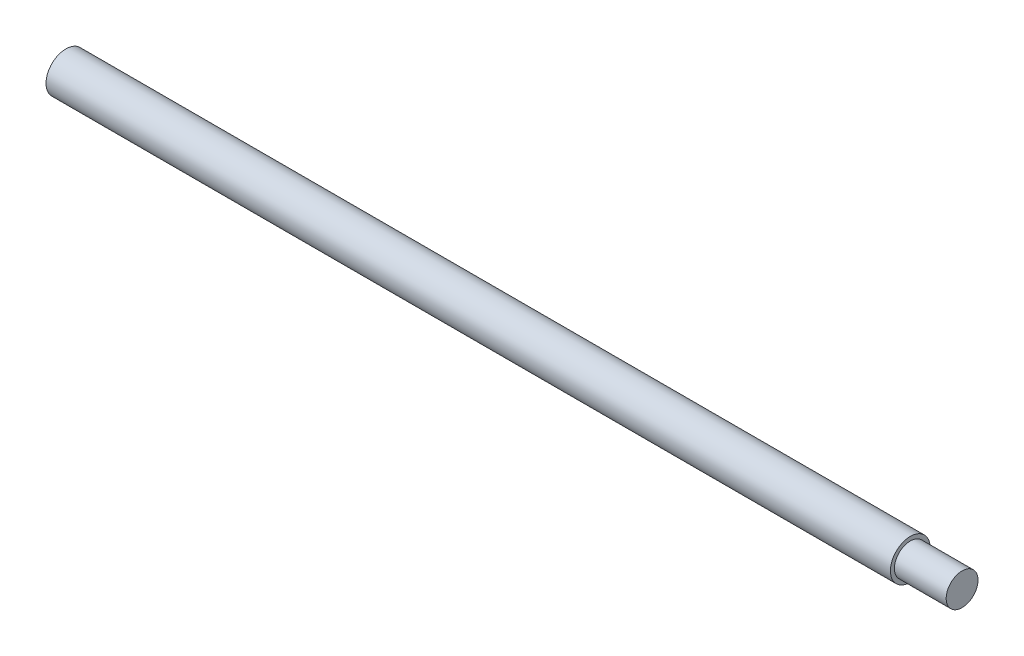
ISO-10303-21;
HEADER;
FILE_DESCRIPTION(('STEP AP214'),'2;1');
FILE_NAME('part.step','',(''),(''),'','','');
FILE_SCHEMA(('AUTOMOTIVE_DESIGN { 1 0 10303 214 1 1 1 1 }'));
ENDSEC;
DATA;
#1=APPLICATION_CONTEXT('core data for automotive mechanical design processes');
#2=APPLICATION_PROTOCOL_DEFINITION('international standard','automotive_design',2000,#1);
#3=PRODUCT_CONTEXT('',#1,'mechanical');
#4=PRODUCT('Part','Part','',(#3));
#5=PRODUCT_RELATED_PRODUCT_CATEGORY('part','',(#4));
#6=PRODUCT_DEFINITION_FORMATION('','',#4);
#7=PRODUCT_DEFINITION_CONTEXT('part definition',#1,'design');
#8=PRODUCT_DEFINITION('design','',#6,#7);
#9=PRODUCT_DEFINITION_SHAPE('','',#8);
#10=(LENGTH_UNIT() NAMED_UNIT(*) SI_UNIT(.MILLI.,.METRE.));
#11=(NAMED_UNIT(*) PLANE_ANGLE_UNIT() SI_UNIT($,.RADIAN.));
#12=(NAMED_UNIT(*) SI_UNIT($,.STERADIAN.) SOLID_ANGLE_UNIT());
#13=UNCERTAINTY_MEASURE_WITH_UNIT(LENGTH_MEASURE(1.E-05),#10,'distance_accuracy_value','');
#14=(GEOMETRIC_REPRESENTATION_CONTEXT(3) GLOBAL_UNCERTAINTY_ASSIGNED_CONTEXT((#13)) GLOBAL_UNIT_ASSIGNED_CONTEXT((#10,
#11,#12)) REPRESENTATION_CONTEXT('',''));
#15=CARTESIAN_POINT('',(0.,0.,0.));
#16=DIRECTION('',(0.,0.,1.));
#17=DIRECTION('',(1.,0.,0.));
#18=AXIS2_PLACEMENT_3D('',#15,#16,#17);
#19=CARTESIAN_POINT('',(0.,0.,0.));
#20=DIRECTION('',(1.,0.,0.));
#21=DIRECTION('',(0.,0.,-1.));
#22=AXIS2_PLACEMENT_3D('',#19,#20,#21);
#23=PLANE('',#22);
#24=CARTESIAN_POINT('',(0.,0.,0.));
#25=DIRECTION('',(-1.,0.,0.));
#26=DIRECTION('',(0.,0.,1.));
#27=AXIS2_PLACEMENT_3D('',#24,#25,#26);
#28=CIRCLE('',#27,2.);
#29=CARTESIAN_POINT('',(0.,0.,2.));
#30=VERTEX_POINT('',#29);
#31=EDGE_CURVE('E55',#30,#30,#28,.T.);
#32=ORIENTED_EDGE('',*,*,#31,.F.);
#33=EDGE_LOOP('',(#32));
#34=FACE_BOUND('',#33,.T.);
#35=CARTESIAN_POINT('',(0.,0.,0.));
#36=DIRECTION('',(-1.,0.,0.));
#37=DIRECTION('',(0.,0.,1.));
#38=AXIS2_PLACEMENT_3D('',#35,#36,#37);
#39=CIRCLE('',#38,2.5);
#40=CARTESIAN_POINT('',(0.,0.,2.5));
#41=VERTEX_POINT('',#40);
#42=EDGE_CURVE('E10',#41,#41,#39,.T.);
#43=ORIENTED_EDGE('',*,*,#42,.T.);
#44=EDGE_LOOP('',(#43));
#45=FACE_BOUND('',#44,.T.);
#46=ADVANCED_FACE('F35',(#34,#45),#23,.F.);
#47=CARTESIAN_POINT('',(0.,0.,0.));
#48=DIRECTION('',(-1.,0.,0.));
#49=DIRECTION('',(0.,0.,1.));
#50=AXIS2_PLACEMENT_3D('',#47,#48,#49);
#51=CYLINDRICAL_SURFACE('',#50,2.5);
#52=ORIENTED_EDGE('',*,*,#42,.F.);
#53=EDGE_LOOP('',(#52));
#54=FACE_BOUND('',#53,.T.);
#55=CARTESIAN_POINT('',(106.,0.,0.));
#56=DIRECTION('',(-1.,0.,0.));
#57=DIRECTION('',(0.,0.,1.));
#58=AXIS2_PLACEMENT_3D('',#55,#56,#57);
#59=CIRCLE('',#58,2.5);
#60=CARTESIAN_POINT('',(106.,0.,2.5));
#61=VERTEX_POINT('',#60);
#62=EDGE_CURVE('E41',#61,#61,#59,.T.);
#63=ORIENTED_EDGE('',*,*,#62,.T.);
#64=EDGE_LOOP('',(#63));
#65=FACE_BOUND('',#64,.T.);
#66=ADVANCED_FACE('F71',(#54,#65),#51,.T.);
#67=CARTESIAN_POINT('',(106.,2.5,0.));
#68=DIRECTION('',(-1.,0.,0.));
#69=DIRECTION('',(0.,0.,1.));
#70=AXIS2_PLACEMENT_3D('',#67,#68,#69);
#71=PLANE('',#70);
#72=ORIENTED_EDGE('',*,*,#62,.F.);
#73=EDGE_LOOP('',(#72));
#74=FACE_BOUND('',#73,.T.);
#75=CARTESIAN_POINT('',(106.,0.,0.));
#76=DIRECTION('',(-1.,0.,0.));
#77=DIRECTION('',(0.,0.,1.));
#78=AXIS2_PLACEMENT_3D('',#75,#76,#77);
#79=CIRCLE('',#78,2.);
#80=CARTESIAN_POINT('',(106.,0.,2.));
#81=VERTEX_POINT('',#80);
#82=EDGE_CURVE('E45',#81,#81,#79,.T.);
#83=ORIENTED_EDGE('',*,*,#82,.T.);
#84=EDGE_LOOP('',(#83));
#85=FACE_BOUND('',#84,.T.);
#86=ADVANCED_FACE('F75',(#74,#85),#71,.F.);
#87=CARTESIAN_POINT('',(0.,0.,0.));
#88=DIRECTION('',(-1.,0.,0.));
#89=DIRECTION('',(0.,0.,1.));
#90=AXIS2_PLACEMENT_3D('',#87,#88,#89);
#91=CYLINDRICAL_SURFACE('',#90,2.);
#92=ORIENTED_EDGE('',*,*,#82,.F.);
#93=EDGE_LOOP('',(#92));
#94=FACE_BOUND('',#93,.T.);
#95=CARTESIAN_POINT('',(112.5,0.,0.));
#96=DIRECTION('',(-1.,0.,0.));
#97=DIRECTION('',(0.,0.,1.));
#98=AXIS2_PLACEMENT_3D('',#95,#96,#97);
#99=CIRCLE('',#98,2.);
#100=CARTESIAN_POINT('',(112.5,0.,2.));
#101=VERTEX_POINT('',#100);
#102=EDGE_CURVE('E49',#101,#101,#99,.T.);
#103=ORIENTED_EDGE('',*,*,#102,.T.);
#104=EDGE_LOOP('',(#103));
#105=FACE_BOUND('',#104,.T.);
#106=ADVANCED_FACE('F80',(#94,#105),#91,.T.);
#107=CARTESIAN_POINT('',(112.5,2.,0.));
#108=DIRECTION('',(-1.,0.,0.));
#109=DIRECTION('',(0.,0.,1.));
#110=AXIS2_PLACEMENT_3D('',#107,#108,#109);
#111=PLANE('',#110);
#112=ORIENTED_EDGE('',*,*,#102,.F.);
#113=EDGE_LOOP('',(#112));
#114=FACE_BOUND('',#113,.T.);
#115=ADVANCED_FACE('F66',(#114),#111,.F.);
#116=CARTESIAN_POINT('',(14.,0.,0.));
#117=DIRECTION('',(-1.,0.,0.));
#118=DIRECTION('',(0.,0.,1.));
#119=AXIS2_PLACEMENT_3D('',#116,#117,#118);
#120=CYLINDRICAL_SURFACE('',#119,2.);
#121=CARTESIAN_POINT('',(14.,0.,0.));
#122=DIRECTION('',(-1.,0.,0.));
#123=DIRECTION('',(0.,0.,1.));
#124=AXIS2_PLACEMENT_3D('',#121,#122,#123);
#125=CIRCLE('',#124,2.);
#126=CARTESIAN_POINT('',(14.,0.,2.));
#127=VERTEX_POINT('',#126);
#128=EDGE_CURVE('E54',#127,#127,#125,.T.);
#129=ORIENTED_EDGE('',*,*,#128,.F.);
#130=EDGE_LOOP('',(#129));
#131=FACE_BOUND('',#130,.T.);
#132=ORIENTED_EDGE('',*,*,#31,.T.);
#133=EDGE_LOOP('',(#132));
#134=FACE_BOUND('',#133,.T.);
#135=ADVANCED_FACE('F63',(#131,#134),#120,.F.);
#136=CARTESIAN_POINT('',(14.,0.,0.));
#137=DIRECTION('',(-1.,0.,0.));
#138=DIRECTION('',(0.,0.,1.));
#139=AXIS2_PLACEMENT_3D('',#136,#137,#138);
#140=PLANE('',#139);
#141=ORIENTED_EDGE('',*,*,#128,.T.);
#142=EDGE_LOOP('',(#141));
#143=FACE_BOUND('',#142,.T.);
#144=ADVANCED_FACE('F61',(#143),#140,.T.);
#145=CLOSED_SHELL('',(#46,#66,#86,#106,#115,#135,#144));
#146=MANIFOLD_SOLID_BREP('B2',#145);
#147=ADVANCED_BREP_SHAPE_REPRESENTATION('',(#18,#146),#14);
#148=SHAPE_DEFINITION_REPRESENTATION(#9,#147);
ENDSEC;
END-ISO-10303-21;
